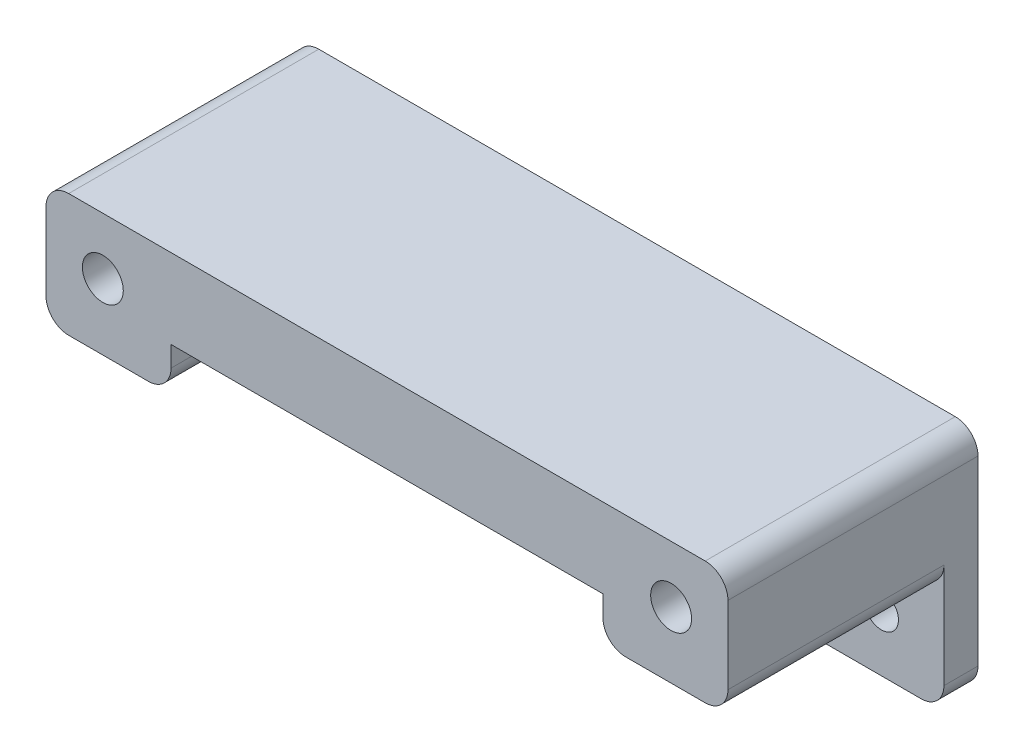
ISO-10303-21;
HEADER;
FILE_DESCRIPTION(('STEP AP214'),'2;1');
FILE_NAME('part.step','',(''),(''),'','','');
FILE_SCHEMA(('AUTOMOTIVE_DESIGN { 1 0 10303 214 1 1 1 1 }'));
ENDSEC;
DATA;
#1=APPLICATION_CONTEXT('core data for automotive mechanical design processes');
#2=APPLICATION_PROTOCOL_DEFINITION('international standard','automotive_design',2000,#1);
#3=PRODUCT_CONTEXT('',#1,'mechanical');
#4=PRODUCT('Part','Part','',(#3));
#5=PRODUCT_RELATED_PRODUCT_CATEGORY('part','',(#4));
#6=PRODUCT_DEFINITION_FORMATION('','',#4);
#7=PRODUCT_DEFINITION_CONTEXT('part definition',#1,'design');
#8=PRODUCT_DEFINITION('design','',#6,#7);
#9=PRODUCT_DEFINITION_SHAPE('','',#8);
#10=(LENGTH_UNIT() NAMED_UNIT(*) SI_UNIT(.MILLI.,.METRE.));
#11=(NAMED_UNIT(*) PLANE_ANGLE_UNIT() SI_UNIT($,.RADIAN.));
#12=(NAMED_UNIT(*) SI_UNIT($,.STERADIAN.) SOLID_ANGLE_UNIT());
#13=UNCERTAINTY_MEASURE_WITH_UNIT(LENGTH_MEASURE(1.E-05),#10,'distance_accuracy_value','');
#14=(GEOMETRIC_REPRESENTATION_CONTEXT(3) GLOBAL_UNCERTAINTY_ASSIGNED_CONTEXT((#13)) GLOBAL_UNIT_ASSIGNED_CONTEXT((#10,
#11,#12)) REPRESENTATION_CONTEXT('',''));
#15=CARTESIAN_POINT('',(0.,0.,0.));
#16=DIRECTION('',(0.,0.,1.));
#17=DIRECTION('',(1.,0.,0.));
#18=AXIS2_PLACEMENT_3D('',#15,#16,#17);
#19=CARTESIAN_POINT('',(0.,0.,3.));
#20=DIRECTION('',(0.,0.,1.));
#21=DIRECTION('',(1.,0.,0.));
#22=AXIS2_PLACEMENT_3D('',#19,#20,#21);
#23=PLANE('',#22);
#24=DIRECTION('',(0.,-1.,0.));
#25=VECTOR('',#24,1.);
#26=CARTESIAN_POINT('',(-23.5096153846154,-9.66346153846153,3.));
#27=LINE('',#26,#25);
#28=CARTESIAN_POINT('',(-23.5096153846154,-18.4704612604795,3.));
#29=VERTEX_POINT('',#28);
#30=CARTESIAN_POINT('',(-23.5096153846154,-27.6634615384615,3.));
#31=VERTEX_POINT('',#30);
#32=EDGE_CURVE('E236',#29,#31,#27,.T.);
#33=ORIENTED_EDGE('',*,*,#32,.T.);
#34=CARTESIAN_POINT('',(-21.5096153846154,-27.6634615384615,3.));
#35=DIRECTION('',(0.,0.,1.));
#36=DIRECTION('',(1.,0.,0.));
#37=AXIS2_PLACEMENT_3D('',#34,#35,#36);
#38=CIRCLE('',#37,2.);
#39=CARTESIAN_POINT('',(-21.5096153846154,-29.6634615384615,3.));
#40=VERTEX_POINT('',#39);
#41=EDGE_CURVE('E300',#31,#40,#38,.T.);
#42=ORIENTED_EDGE('',*,*,#41,.T.);
#43=DIRECTION('',(1.,0.,0.));
#44=VECTOR('',#43,1.);
#45=CARTESIAN_POINT('',(-23.5096153846154,-29.6634615384615,3.));
#46=LINE('',#45,#44);
#47=CARTESIAN_POINT('',(34.4903846153846,-29.6634615384615,3.));
#48=VERTEX_POINT('',#47);
#49=EDGE_CURVE('E239',#40,#48,#46,.T.);
#50=ORIENTED_EDGE('',*,*,#49,.T.);
#51=CARTESIAN_POINT('',(34.4903846153846,-27.6634615384615,3.));
#52=DIRECTION('',(0.,0.,1.));
#53=DIRECTION('',(1.,0.,0.));
#54=AXIS2_PLACEMENT_3D('',#51,#52,#53);
#55=CIRCLE('',#54,2.);
#56=CARTESIAN_POINT('',(36.4903846153846,-27.6634615384615,3.));
#57=VERTEX_POINT('',#56);
#58=EDGE_CURVE('E62',#48,#57,#55,.T.);
#59=ORIENTED_EDGE('',*,*,#58,.T.);
#60=DIRECTION('',(0.,1.,0.));
#61=VECTOR('',#60,1.);
#62=CARTESIAN_POINT('',(36.4903846153846,-9.66346153846153,3.));
#63=LINE('',#62,#61);
#64=CARTESIAN_POINT('',(36.4903846153846,-18.4704612604795,3.));
#65=VERTEX_POINT('',#64);
#66=EDGE_CURVE('E57',#57,#65,#63,.T.);
#67=ORIENTED_EDGE('',*,*,#66,.T.);
#68=CARTESIAN_POINT('',(34.4903846153846,-18.4704612604795,3.));
#69=DIRECTION('',(0.,0.,1.));
#70=DIRECTION('',(1.,0.,0.));
#71=AXIS2_PLACEMENT_3D('',#68,#69,#70);
#72=CIRCLE('',#71,2.);
#73=CARTESIAN_POINT('',(34.4903846153846,-20.4704612604795,3.));
#74=VERTEX_POINT('',#73);
#75=EDGE_CURVE('E11',#65,#74,#72,.F.);
#76=ORIENTED_EDGE('',*,*,#75,.T.);
#77=DIRECTION('',(1.,0.,0.));
#78=VECTOR('',#77,1.);
#79=CARTESIAN_POINT('',(36.4903846153846,-20.4704612604795,3.));
#80=LINE('',#79,#78);
#81=CARTESIAN_POINT('',(27.4903846153846,-20.4704612604795,3.));
#82=VERTEX_POINT('',#81);
#83=EDGE_CURVE('E216',#82,#74,#80,.T.);
#84=ORIENTED_EDGE('',*,*,#83,.F.);
#85=CARTESIAN_POINT('',(27.4903846153846,-18.4704612604795,3.));
#86=DIRECTION('',(0.,0.,1.));
#87=DIRECTION('',(1.,0.,0.));
#88=AXIS2_PLACEMENT_3D('',#85,#86,#87);
#89=CIRCLE('',#88,2.);
#90=CARTESIAN_POINT('',(25.4903846153846,-18.4704612604795,3.));
#91=VERTEX_POINT('',#90);
#92=EDGE_CURVE('E317',#82,#91,#89,.F.);
#93=ORIENTED_EDGE('',*,*,#92,.T.);
#94=DIRECTION('',(0.,-1.,0.));
#95=VECTOR('',#94,1.);
#96=CARTESIAN_POINT('',(25.4903846153846,-20.4704612604795,3.));
#97=LINE('',#96,#95);
#98=CARTESIAN_POINT('',(25.4903846153846,-16.6634615384615,3.));
#99=VERTEX_POINT('',#98);
#100=EDGE_CURVE('E213',#99,#91,#97,.T.);
#101=ORIENTED_EDGE('',*,*,#100,.F.);
#102=DIRECTION('',(1.,0.,0.));
#103=VECTOR('',#102,1.);
#104=CARTESIAN_POINT('',(6.49038461538461,-16.6634615384615,3.));
#105=LINE('',#104,#103);
#106=CARTESIAN_POINT('',(-12.5096153846154,-16.6634615384615,3.));
#107=VERTEX_POINT('',#106);
#108=EDGE_CURVE('E185',#107,#99,#105,.T.);
#109=ORIENTED_EDGE('',*,*,#108,.F.);
#110=DIRECTION('',(0.,1.,0.));
#111=VECTOR('',#110,1.);
#112=CARTESIAN_POINT('',(-12.5096153846154,-16.6634615384615,3.));
#113=LINE('',#112,#111);
#114=CARTESIAN_POINT('',(-12.5096153846154,-18.4704612604795,3.));
#115=VERTEX_POINT('',#114);
#116=EDGE_CURVE('E178',#115,#107,#113,.T.);
#117=ORIENTED_EDGE('',*,*,#116,.F.);
#118=CARTESIAN_POINT('',(-14.5096153846154,-18.4704612604795,3.));
#119=DIRECTION('',(0.,0.,1.));
#120=DIRECTION('',(1.,0.,0.));
#121=AXIS2_PLACEMENT_3D('',#118,#119,#120);
#122=CIRCLE('',#121,2.);
#123=CARTESIAN_POINT('',(-14.5096153846154,-20.4704612604795,3.));
#124=VERTEX_POINT('',#123);
#125=EDGE_CURVE('E315',#115,#124,#122,.F.);
#126=ORIENTED_EDGE('',*,*,#125,.T.);
#127=DIRECTION('',(1.,0.,0.));
#128=VECTOR('',#127,1.);
#129=CARTESIAN_POINT('',(-12.5096153846154,-20.4704612604795,3.));
#130=LINE('',#129,#128);
#131=CARTESIAN_POINT('',(-21.5096153846154,-20.4704612604795,3.));
#132=VERTEX_POINT('',#131);
#133=EDGE_CURVE('E219',#132,#124,#130,.T.);
#134=ORIENTED_EDGE('',*,*,#133,.F.);
#135=CARTESIAN_POINT('',(-21.5096153846154,-18.4704612604795,3.));
#136=DIRECTION('',(0.,0.,1.));
#137=DIRECTION('',(1.,0.,0.));
#138=AXIS2_PLACEMENT_3D('',#135,#136,#137);
#139=CIRCLE('',#138,2.);
#140=EDGE_CURVE('E51',#132,#29,#139,.F.);
#141=ORIENTED_EDGE('',*,*,#140,.T.);
#142=EDGE_LOOP('',(#33,#42,#50,#59,#67,#76,#84,#93,#101,#109,#117,#126,#134,#141));
#143=FACE_BOUND('',#142,.T.);
#144=CARTESIAN_POINT('',(30.9903846153846,-24.6634615384615,3.));
#145=DIRECTION('',(0.,0.,1.));
#146=DIRECTION('',(1.,0.,0.));
#147=AXIS2_PLACEMENT_3D('',#144,#145,#146);
#148=CIRCLE('',#147,1.5);
#149=CARTESIAN_POINT('',(32.4903846153846,-24.6634615384615,3.));
#150=VERTEX_POINT('',#149);
#151=EDGE_CURVE('E230',#150,#150,#148,.T.);
#152=ORIENTED_EDGE('',*,*,#151,.F.);
#153=EDGE_LOOP('',(#152));
#154=FACE_BOUND('',#153,.T.);
#155=CARTESIAN_POINT('',(-18.0096153846154,-24.6634615384615,3.));
#156=DIRECTION('',(0.,0.,1.));
#157=DIRECTION('',(1.,0.,0.));
#158=AXIS2_PLACEMENT_3D('',#155,#156,#157);
#159=CIRCLE('',#158,1.5);
#160=CARTESIAN_POINT('',(-16.5096153846154,-24.6634615384615,3.));
#161=VERTEX_POINT('',#160);
#162=EDGE_CURVE('E224',#161,#161,#159,.T.);
#163=ORIENTED_EDGE('',*,*,#162,.F.);
#164=EDGE_LOOP('',(#163));
#165=FACE_BOUND('',#164,.T.);
#166=ADVANCED_FACE('F43',(#143,#154,#165),#23,.T.);
#167=CARTESIAN_POINT('',(0.,0.,0.));
#168=DIRECTION('',(0.,0.,1.));
#169=DIRECTION('',(1.,0.,0.));
#170=AXIS2_PLACEMENT_3D('',#167,#168,#169);
#171=PLANE('',#170);
#172=CARTESIAN_POINT('',(31.4903846153846,-14.6634615384615,0.));
#173=DIRECTION('',(0.,0.,1.));
#174=DIRECTION('',(1.,0.,0.));
#175=AXIS2_PLACEMENT_3D('',#172,#173,#174);
#176=CIRCLE('',#175,1.8);
#177=CARTESIAN_POINT('',(33.2903846153846,-14.6634615384615,0.));
#178=VERTEX_POINT('',#177);
#179=EDGE_CURVE('E214',#178,#178,#176,.T.);
#180=ORIENTED_EDGE('',*,*,#179,.T.);
#181=EDGE_LOOP('',(#180));
#182=FACE_BOUND('',#181,.T.);
#183=CARTESIAN_POINT('',(-18.5096153846154,-14.6634615384615,0.));
#184=DIRECTION('',(0.,0.,1.));
#185=DIRECTION('',(1.,0.,0.));
#186=AXIS2_PLACEMENT_3D('',#183,#184,#185);
#187=CIRCLE('',#186,1.8);
#188=CARTESIAN_POINT('',(-16.7096153846154,-14.6634615384615,0.));
#189=VERTEX_POINT('',#188);
#190=EDGE_CURVE('E428',#189,#189,#187,.T.);
#191=ORIENTED_EDGE('',*,*,#190,.T.);
#192=EDGE_LOOP('',(#191));
#193=FACE_BOUND('',#192,.T.);
#194=DIRECTION('',(1.,0.,0.));
#195=VECTOR('',#194,1.);
#196=CARTESIAN_POINT('',(-23.5096153846154,-29.6634615384615,0.));
#197=LINE('',#196,#195);
#198=CARTESIAN_POINT('',(-21.5096153846154,-29.6634615384615,0.));
#199=VERTEX_POINT('',#198);
#200=CARTESIAN_POINT('',(34.4903846153846,-29.6634615384615,0.));
#201=VERTEX_POINT('',#200);
#202=EDGE_CURVE('E246',#199,#201,#197,.T.);
#203=ORIENTED_EDGE('',*,*,#202,.F.);
#204=CARTESIAN_POINT('',(-21.5096153846154,-27.6634615384615,0.));
#205=DIRECTION('',(0.,0.,1.));
#206=DIRECTION('',(1.,0.,0.));
#207=AXIS2_PLACEMENT_3D('',#204,#205,#206);
#208=CIRCLE('',#207,2.);
#209=CARTESIAN_POINT('',(-23.5096153846154,-27.6634615384615,0.));
#210=VERTEX_POINT('',#209);
#211=EDGE_CURVE('E290',#199,#210,#208,.F.);
#212=ORIENTED_EDGE('',*,*,#211,.T.);
#213=DIRECTION('',(0.,-1.,0.));
#214=VECTOR('',#213,1.);
#215=CARTESIAN_POINT('',(-23.5096153846154,-9.66346153846153,0.));
#216=LINE('',#215,#214);
#217=CARTESIAN_POINT('',(-23.5096153846154,-11.6634615384615,0.));
#218=VERTEX_POINT('',#217);
#219=EDGE_CURVE('E233',#218,#210,#216,.T.);
#220=ORIENTED_EDGE('',*,*,#219,.F.);
#221=CARTESIAN_POINT('',(-21.5096153846154,-11.6634615384615,0.));
#222=DIRECTION('',(0.,0.,1.));
#223=DIRECTION('',(1.,0.,0.));
#224=AXIS2_PLACEMENT_3D('',#221,#222,#223);
#225=CIRCLE('',#224,2.);
#226=CARTESIAN_POINT('',(-21.5096153846154,-9.66346153846153,0.));
#227=VERTEX_POINT('',#226);
#228=EDGE_CURVE('E286',#218,#227,#225,.F.);
#229=ORIENTED_EDGE('',*,*,#228,.T.);
#230=DIRECTION('',(-1.,0.,0.));
#231=VECTOR('',#230,1.);
#232=CARTESIAN_POINT('',(-23.5096153846154,-9.66346153846153,0.));
#233=LINE('',#232,#231);
#234=CARTESIAN_POINT('',(34.4903846153846,-9.66346153846153,0.));
#235=VERTEX_POINT('',#234);
#236=EDGE_CURVE('E240',#235,#227,#233,.T.);
#237=ORIENTED_EDGE('',*,*,#236,.F.);
#238=CARTESIAN_POINT('',(34.4903846153846,-11.6634615384615,0.));
#239=DIRECTION('',(0.,0.,1.));
#240=DIRECTION('',(1.,0.,0.));
#241=AXIS2_PLACEMENT_3D('',#238,#239,#240);
#242=CIRCLE('',#241,2.);
#243=CARTESIAN_POINT('',(36.4903846153846,-11.6634615384615,0.));
#244=VERTEX_POINT('',#243);
#245=EDGE_CURVE('E284',#235,#244,#242,.F.);
#246=ORIENTED_EDGE('',*,*,#245,.T.);
#247=DIRECTION('',(0.,1.,0.));
#248=VECTOR('',#247,1.);
#249=CARTESIAN_POINT('',(36.4903846153846,-9.66346153846153,0.));
#250=LINE('',#249,#248);
#251=CARTESIAN_POINT('',(36.4903846153846,-27.6634615384615,0.));
#252=VERTEX_POINT('',#251);
#253=EDGE_CURVE('E249',#252,#244,#250,.T.);
#254=ORIENTED_EDGE('',*,*,#253,.F.);
#255=CARTESIAN_POINT('',(34.4903846153846,-27.6634615384615,0.));
#256=DIRECTION('',(0.,0.,1.));
#257=DIRECTION('',(1.,0.,0.));
#258=AXIS2_PLACEMENT_3D('',#255,#256,#257);
#259=CIRCLE('',#258,2.);
#260=EDGE_CURVE('E288',#252,#201,#259,.F.);
#261=ORIENTED_EDGE('',*,*,#260,.T.);
#262=EDGE_LOOP('',(#203,#212,#220,#229,#237,#246,#254,#261));
#263=FACE_BOUND('',#262,.T.);
#264=CARTESIAN_POINT('',(30.9903846153846,-24.6634615384615,0.));
#265=DIRECTION('',(0.,0.,1.));
#266=DIRECTION('',(1.,0.,0.));
#267=AXIS2_PLACEMENT_3D('',#264,#265,#266);
#268=CIRCLE('',#267,1.5);
#269=CARTESIAN_POINT('',(32.4903846153846,-24.6634615384615,0.));
#270=VERTEX_POINT('',#269);
#271=EDGE_CURVE('E227',#270,#270,#268,.T.);
#272=ORIENTED_EDGE('',*,*,#271,.T.);
#273=EDGE_LOOP('',(#272));
#274=FACE_BOUND('',#273,.T.);
#275=CARTESIAN_POINT('',(-18.0096153846154,-24.6634615384615,0.));
#276=DIRECTION('',(0.,0.,1.));
#277=DIRECTION('',(1.,0.,0.));
#278=AXIS2_PLACEMENT_3D('',#275,#276,#277);
#279=CIRCLE('',#278,1.5);
#280=CARTESIAN_POINT('',(-16.5096153846154,-24.6634615384615,0.));
#281=VERTEX_POINT('',#280);
#282=EDGE_CURVE('E188',#281,#281,#279,.T.);
#283=ORIENTED_EDGE('',*,*,#282,.T.);
#284=EDGE_LOOP('',(#283));
#285=FACE_BOUND('',#284,.T.);
#286=ADVANCED_FACE('F341',(#182,#193,#263,#274,#285),#171,.F.);
#287=CARTESIAN_POINT('',(-23.5096153846154,-9.66346153846153,3.));
#288=DIRECTION('',(1.,0.,0.));
#289=DIRECTION('',(0.,1.,0.));
#290=AXIS2_PLACEMENT_3D('',#287,#288,#289);
#291=PLANE('',#290);
#292=ORIENTED_EDGE('',*,*,#219,.T.);
#293=DIRECTION('',(0.,0.,-1.));
#294=VECTOR('',#293,1.);
#295=CARTESIAN_POINT('',(-23.5096153846154,-27.6634615384615,3.));
#296=LINE('',#295,#294);
#297=EDGE_CURVE('E297',#210,#31,#296,.F.);
#298=ORIENTED_EDGE('',*,*,#297,.T.);
#299=ORIENTED_EDGE('',*,*,#32,.F.);
#300=DIRECTION('',(0.,0.,-1.));
#301=VECTOR('',#300,1.);
#302=CARTESIAN_POINT('',(-23.5096153846154,-18.4704612604795,3.));
#303=LINE('',#302,#301);
#304=CARTESIAN_POINT('',(-23.5096153846154,-18.4704612604795,22.));
#305=VERTEX_POINT('',#304);
#306=EDGE_CURVE('E295',#29,#305,#303,.F.);
#307=ORIENTED_EDGE('',*,*,#306,.T.);
#308=DIRECTION('',(0.,-1.,0.));
#309=VECTOR('',#308,1.);
#310=CARTESIAN_POINT('',(-23.5096153846154,-20.4704612604795,22.));
#311=LINE('',#310,#309);
#312=CARTESIAN_POINT('',(-23.5096153846154,-11.6634615384615,22.));
#313=VERTEX_POINT('',#312);
#314=EDGE_CURVE('E206',#313,#305,#311,.T.);
#315=ORIENTED_EDGE('',*,*,#314,.F.);
#316=DIRECTION('',(0.,0.,-1.));
#317=VECTOR('',#316,1.);
#318=CARTESIAN_POINT('',(-23.5096153846154,-11.6634615384615,3.));
#319=LINE('',#318,#317);
#320=EDGE_CURVE('E292',#313,#218,#319,.T.);
#321=ORIENTED_EDGE('',*,*,#320,.T.);
#322=EDGE_LOOP('',(#292,#298,#299,#307,#315,#321));
#323=FACE_BOUND('',#322,.T.);
#324=ADVANCED_FACE('F329',(#323),#291,.F.);
#325=CARTESIAN_POINT('',(-23.5096153846154,-29.6634615384615,3.));
#326=DIRECTION('',(0.,1.,0.));
#327=DIRECTION('',(0.,0.,1.));
#328=AXIS2_PLACEMENT_3D('',#325,#326,#327);
#329=PLANE('',#328);
#330=ORIENTED_EDGE('',*,*,#49,.F.);
#331=DIRECTION('',(0.,0.,-1.));
#332=VECTOR('',#331,1.);
#333=CARTESIAN_POINT('',(-21.5096153846154,-29.6634615384615,3.));
#334=LINE('',#333,#332);
#335=EDGE_CURVE('E281',#40,#199,#334,.T.);
#336=ORIENTED_EDGE('',*,*,#335,.T.);
#337=ORIENTED_EDGE('',*,*,#202,.T.);
#338=DIRECTION('',(0.,0.,-1.));
#339=VECTOR('',#338,1.);
#340=CARTESIAN_POINT('',(34.4903846153846,-29.6634615384615,3.));
#341=LINE('',#340,#339);
#342=EDGE_CURVE('E279',#201,#48,#341,.F.);
#343=ORIENTED_EDGE('',*,*,#342,.T.);
#344=EDGE_LOOP('',(#330,#336,#337,#343));
#345=FACE_BOUND('',#344,.T.);
#346=ADVANCED_FACE('F349',(#345),#329,.F.);
#347=CARTESIAN_POINT('',(36.4903846153846,-9.66346153846153,3.));
#348=DIRECTION('',(-1.,0.,0.));
#349=DIRECTION('',(0.,0.,1.));
#350=AXIS2_PLACEMENT_3D('',#347,#348,#349);
#351=PLANE('',#350);
#352=ORIENTED_EDGE('',*,*,#66,.F.);
#353=DIRECTION('',(0.,0.,-1.));
#354=VECTOR('',#353,1.);
#355=CARTESIAN_POINT('',(36.4903846153846,-27.6634615384615,3.));
#356=LINE('',#355,#354);
#357=EDGE_CURVE('E307',#57,#252,#356,.T.);
#358=ORIENTED_EDGE('',*,*,#357,.T.);
#359=ORIENTED_EDGE('',*,*,#253,.T.);
#360=DIRECTION('',(0.,0.,-1.));
#361=VECTOR('',#360,1.);
#362=CARTESIAN_POINT('',(36.4903846153846,-11.6634615384615,3.));
#363=LINE('',#362,#361);
#364=CARTESIAN_POINT('',(36.4903846153846,-11.6634615384615,22.));
#365=VERTEX_POINT('',#364);
#366=EDGE_CURVE('E302',#244,#365,#363,.F.);
#367=ORIENTED_EDGE('',*,*,#366,.T.);
#368=DIRECTION('',(0.,1.,0.));
#369=VECTOR('',#368,1.);
#370=CARTESIAN_POINT('',(36.4903846153846,-9.66346153846153,22.));
#371=LINE('',#370,#369);
#372=CARTESIAN_POINT('',(36.4903846153846,-18.4704612604795,22.));
#373=VERTEX_POINT('',#372);
#374=EDGE_CURVE('E197',#373,#365,#371,.T.);
#375=ORIENTED_EDGE('',*,*,#374,.F.);
#376=DIRECTION('',(0.,0.,-1.));
#377=VECTOR('',#376,1.);
#378=CARTESIAN_POINT('',(36.4903846153846,-18.4704612604795,3.));
#379=LINE('',#378,#377);
#380=EDGE_CURVE('E304',#373,#65,#379,.T.);
#381=ORIENTED_EDGE('',*,*,#380,.T.);
#382=EDGE_LOOP('',(#352,#358,#359,#367,#375,#381));
#383=FACE_BOUND('',#382,.T.);
#384=ADVANCED_FACE('F356',(#383),#351,.F.);
#385=CARTESIAN_POINT('',(-23.5096153846154,-9.66346153846153,3.));
#386=DIRECTION('',(0.,-1.,0.));
#387=DIRECTION('',(0.,0.,-1.));
#388=AXIS2_PLACEMENT_3D('',#385,#386,#387);
#389=PLANE('',#388);
#390=ORIENTED_EDGE('',*,*,#236,.T.);
#391=DIRECTION('',(0.,0.,-1.));
#392=VECTOR('',#391,1.);
#393=CARTESIAN_POINT('',(-21.5096153846154,-9.66346153846153,3.));
#394=LINE('',#393,#392);
#395=CARTESIAN_POINT('',(-21.5096153846154,-9.66346153846153,22.));
#396=VERTEX_POINT('',#395);
#397=EDGE_CURVE('E313',#227,#396,#394,.F.);
#398=ORIENTED_EDGE('',*,*,#397,.T.);
#399=DIRECTION('',(-1.,0.,0.));
#400=VECTOR('',#399,1.);
#401=CARTESIAN_POINT('',(-23.5096153846154,-9.66346153846153,22.));
#402=LINE('',#401,#400);
#403=CARTESIAN_POINT('',(34.4903846153846,-9.66346153846153,22.));
#404=VERTEX_POINT('',#403);
#405=EDGE_CURVE('E203',#404,#396,#402,.T.);
#406=ORIENTED_EDGE('',*,*,#405,.F.);
#407=DIRECTION('',(0.,0.,-1.));
#408=VECTOR('',#407,1.);
#409=CARTESIAN_POINT('',(34.4903846153846,-9.66346153846153,3.));
#410=LINE('',#409,#408);
#411=EDGE_CURVE('E310',#404,#235,#410,.T.);
#412=ORIENTED_EDGE('',*,*,#411,.T.);
#413=EDGE_LOOP('',(#390,#398,#406,#412));
#414=FACE_BOUND('',#413,.T.);
#415=ADVANCED_FACE('F362',(#414),#389,.F.);
#416=CARTESIAN_POINT('',(30.9903846153846,-24.6634615384615,3.));
#417=DIRECTION('',(0.,0.,-1.));
#418=DIRECTION('',(-1.,0.,0.));
#419=AXIS2_PLACEMENT_3D('',#416,#417,#418);
#420=CYLINDRICAL_SURFACE('',#419,1.5);
#421=ORIENTED_EDGE('',*,*,#151,.T.);
#422=EDGE_LOOP('',(#421));
#423=FACE_BOUND('',#422,.T.);
#424=ORIENTED_EDGE('',*,*,#271,.F.);
#425=EDGE_LOOP('',(#424));
#426=FACE_BOUND('',#425,.T.);
#427=ADVANCED_FACE('F364',(#423,#426),#420,.F.);
#428=CARTESIAN_POINT('',(-18.0096153846154,-24.6634615384615,3.));
#429=DIRECTION('',(0.,0.,-1.));
#430=DIRECTION('',(-1.,0.,0.));
#431=AXIS2_PLACEMENT_3D('',#428,#429,#430);
#432=CYLINDRICAL_SURFACE('',#431,1.5);
#433=ORIENTED_EDGE('',*,*,#162,.T.);
#434=EDGE_LOOP('',(#433));
#435=FACE_BOUND('',#434,.T.);
#436=ORIENTED_EDGE('',*,*,#282,.F.);
#437=EDGE_LOOP('',(#436));
#438=FACE_BOUND('',#437,.T.);
#439=ADVANCED_FACE('F371',(#435,#438),#432,.F.);
#440=CARTESIAN_POINT('',(6.49038461538461,-16.6634615384615,22.));
#441=DIRECTION('',(0.,1.,0.));
#442=DIRECTION('',(-1.,0.,0.));
#443=AXIS2_PLACEMENT_3D('',#440,#441,#442);
#444=PLANE('',#443);
#445=ORIENTED_EDGE('',*,*,#108,.T.);
#446=DIRECTION('',(0.,0.,-1.));
#447=VECTOR('',#446,1.);
#448=CARTESIAN_POINT('',(25.4903846153846,-16.6634615384615,22.));
#449=LINE('',#448,#447);
#450=CARTESIAN_POINT('',(25.4903846153846,-16.6634615384615,22.));
#451=VERTEX_POINT('',#450);
#452=EDGE_CURVE('E182',#451,#99,#449,.T.);
#453=ORIENTED_EDGE('',*,*,#452,.F.);
#454=DIRECTION('',(1.,0.,0.));
#455=VECTOR('',#454,1.);
#456=CARTESIAN_POINT('',(6.49038461538461,-16.6634615384615,22.));
#457=LINE('',#456,#455);
#458=CARTESIAN_POINT('',(-12.5096153846154,-16.6634615384615,22.));
#459=VERTEX_POINT('',#458);
#460=EDGE_CURVE('E166',#459,#451,#457,.T.);
#461=ORIENTED_EDGE('',*,*,#460,.F.);
#462=DIRECTION('',(0.,0.,-1.));
#463=VECTOR('',#462,1.);
#464=CARTESIAN_POINT('',(-12.5096153846154,-16.6634615384615,22.));
#465=LINE('',#464,#463);
#466=EDGE_CURVE('E189',#459,#107,#465,.T.);
#467=ORIENTED_EDGE('',*,*,#466,.T.);
#468=EDGE_LOOP('',(#445,#453,#461,#467));
#469=FACE_BOUND('',#468,.T.);
#470=ADVANCED_FACE('F183',(#469),#444,.F.);
#471=CARTESIAN_POINT('',(25.4903846153846,-20.4704612604795,22.));
#472=DIRECTION('',(1.,0.,0.));
#473=DIRECTION('',(0.,0.,-1.));
#474=AXIS2_PLACEMENT_3D('',#471,#472,#473);
#475=PLANE('',#474);
#476=ORIENTED_EDGE('',*,*,#100,.T.);
#477=DIRECTION('',(0.,0.,-1.));
#478=VECTOR('',#477,1.);
#479=CARTESIAN_POINT('',(25.4903846153846,-18.4704612604795,22.));
#480=LINE('',#479,#478);
#481=CARTESIAN_POINT('',(25.4903846153846,-18.4704612604795,22.));
#482=VERTEX_POINT('',#481);
#483=EDGE_CURVE('E193',#91,#482,#480,.F.);
#484=ORIENTED_EDGE('',*,*,#483,.T.);
#485=DIRECTION('',(0.,-1.,0.));
#486=VECTOR('',#485,1.);
#487=CARTESIAN_POINT('',(25.4903846153846,-20.4704612604795,22.));
#488=LINE('',#487,#486);
#489=EDGE_CURVE('E171',#451,#482,#488,.T.);
#490=ORIENTED_EDGE('',*,*,#489,.F.);
#491=ORIENTED_EDGE('',*,*,#452,.T.);
#492=EDGE_LOOP('',(#476,#484,#490,#491));
#493=FACE_BOUND('',#492,.T.);
#494=ADVANCED_FACE('F191',(#493),#475,.F.);
#495=CARTESIAN_POINT('',(36.4903846153846,-20.4704612604795,22.));
#496=DIRECTION('',(0.,1.,0.));
#497=DIRECTION('',(0.,0.,1.));
#498=AXIS2_PLACEMENT_3D('',#495,#496,#497);
#499=PLANE('',#498);
#500=DIRECTION('',(1.,0.,0.));
#501=VECTOR('',#500,1.);
#502=CARTESIAN_POINT('',(36.4903846153846,-20.4704612604795,22.));
#503=LINE('',#502,#501);
#504=CARTESIAN_POINT('',(27.4903846153846,-20.4704612604795,22.));
#505=VERTEX_POINT('',#504);
#506=CARTESIAN_POINT('',(34.4903846153846,-20.4704612604795,22.));
#507=VERTEX_POINT('',#506);
#508=EDGE_CURVE('E194',#505,#507,#503,.T.);
#509=ORIENTED_EDGE('',*,*,#508,.F.);
#510=DIRECTION('',(0.,0.,-1.));
#511=VECTOR('',#510,1.);
#512=CARTESIAN_POINT('',(27.4903846153846,-20.4704612604795,22.));
#513=LINE('',#512,#511);
#514=EDGE_CURVE('E275',#505,#82,#513,.T.);
#515=ORIENTED_EDGE('',*,*,#514,.T.);
#516=ORIENTED_EDGE('',*,*,#83,.T.);
#517=DIRECTION('',(0.,0.,-1.));
#518=VECTOR('',#517,1.);
#519=CARTESIAN_POINT('',(34.4903846153846,-20.4704612604795,22.));
#520=LINE('',#519,#518);
#521=EDGE_CURVE('E273',#74,#507,#520,.F.);
#522=ORIENTED_EDGE('',*,*,#521,.T.);
#523=EDGE_LOOP('',(#509,#515,#516,#522));
#524=FACE_BOUND('',#523,.T.);
#525=ADVANCED_FACE('F390',(#524),#499,.F.);
#526=CARTESIAN_POINT('',(-12.5096153846154,-20.4704612604795,22.));
#527=DIRECTION('',(0.,1.,0.));
#528=DIRECTION('',(0.,0.,1.));
#529=AXIS2_PLACEMENT_3D('',#526,#527,#528);
#530=PLANE('',#529);
#531=ORIENTED_EDGE('',*,*,#133,.T.);
#532=DIRECTION('',(0.,0.,-1.));
#533=VECTOR('',#532,1.);
#534=CARTESIAN_POINT('',(-14.5096153846154,-20.4704612604795,22.));
#535=LINE('',#534,#533);
#536=CARTESIAN_POINT('',(-14.5096153846154,-20.4704612604795,22.));
#537=VERTEX_POINT('',#536);
#538=EDGE_CURVE('E259',#124,#537,#535,.F.);
#539=ORIENTED_EDGE('',*,*,#538,.T.);
#540=DIRECTION('',(1.,0.,0.));
#541=VECTOR('',#540,1.);
#542=CARTESIAN_POINT('',(-12.5096153846154,-20.4704612604795,22.));
#543=LINE('',#542,#541);
#544=CARTESIAN_POINT('',(-21.5096153846154,-20.4704612604795,22.));
#545=VERTEX_POINT('',#544);
#546=EDGE_CURVE('E209',#545,#537,#543,.T.);
#547=ORIENTED_EDGE('',*,*,#546,.F.);
#548=DIRECTION('',(0.,0.,-1.));
#549=VECTOR('',#548,1.);
#550=CARTESIAN_POINT('',(-21.5096153846154,-20.4704612604795,22.));
#551=LINE('',#550,#549);
#552=EDGE_CURVE('E256',#545,#132,#551,.T.);
#553=ORIENTED_EDGE('',*,*,#552,.T.);
#554=EDGE_LOOP('',(#531,#539,#547,#553));
#555=FACE_BOUND('',#554,.T.);
#556=ADVANCED_FACE('F393',(#555),#530,.F.);
#557=CARTESIAN_POINT('',(-12.5096153846154,-16.6634615384615,22.));
#558=DIRECTION('',(-1.,0.,0.));
#559=DIRECTION('',(0.,0.,1.));
#560=AXIS2_PLACEMENT_3D('',#557,#558,#559);
#561=PLANE('',#560);
#562=DIRECTION('',(0.,1.,0.));
#563=VECTOR('',#562,1.);
#564=CARTESIAN_POINT('',(-12.5096153846154,-16.6634615384615,22.));
#565=LINE('',#564,#563);
#566=CARTESIAN_POINT('',(-12.5096153846154,-18.4704612604795,22.));
#567=VERTEX_POINT('',#566);
#568=EDGE_CURVE('E174',#567,#459,#565,.T.);
#569=ORIENTED_EDGE('',*,*,#568,.F.);
#570=DIRECTION('',(0.,0.,-1.));
#571=VECTOR('',#570,1.);
#572=CARTESIAN_POINT('',(-12.5096153846154,-18.4704612604795,22.));
#573=LINE('',#572,#571);
#574=EDGE_CURVE('E243',#567,#115,#573,.T.);
#575=ORIENTED_EDGE('',*,*,#574,.T.);
#576=ORIENTED_EDGE('',*,*,#116,.T.);
#577=ORIENTED_EDGE('',*,*,#466,.F.);
#578=EDGE_LOOP('',(#569,#575,#576,#577));
#579=FACE_BOUND('',#578,.T.);
#580=ADVANCED_FACE('F397',(#579),#561,.F.);
#581=CARTESIAN_POINT('',(0.,0.,22.));
#582=DIRECTION('',(0.,0.,1.));
#583=DIRECTION('',(1.,0.,0.));
#584=AXIS2_PLACEMENT_3D('',#581,#582,#583);
#585=PLANE('',#584);
#586=CARTESIAN_POINT('',(31.4903846153846,-14.6634615384615,22.));
#587=DIRECTION('',(0.,0.,1.));
#588=DIRECTION('',(1.,0.,0.));
#589=AXIS2_PLACEMENT_3D('',#586,#587,#588);
#590=CIRCLE('',#589,1.8);
#591=CARTESIAN_POINT('',(33.2903846153846,-14.6634615384615,22.));
#592=VERTEX_POINT('',#591);
#593=EDGE_CURVE('E423',#592,#592,#590,.T.);
#594=ORIENTED_EDGE('',*,*,#593,.F.);
#595=EDGE_LOOP('',(#594));
#596=FACE_BOUND('',#595,.T.);
#597=CARTESIAN_POINT('',(-18.5096153846154,-14.6634615384615,22.));
#598=DIRECTION('',(0.,0.,1.));
#599=DIRECTION('',(1.,0.,0.));
#600=AXIS2_PLACEMENT_3D('',#597,#598,#599);
#601=CIRCLE('',#600,1.8);
#602=CARTESIAN_POINT('',(-16.7096153846154,-14.6634615384615,22.));
#603=VERTEX_POINT('',#602);
#604=EDGE_CURVE('E424',#603,#603,#601,.T.);
#605=ORIENTED_EDGE('',*,*,#604,.F.);
#606=EDGE_LOOP('',(#605));
#607=FACE_BOUND('',#606,.T.);
#608=ORIENTED_EDGE('',*,*,#546,.T.);
#609=CARTESIAN_POINT('',(-14.5096153846154,-18.4704612604795,22.));
#610=DIRECTION('',(0.,0.,1.));
#611=DIRECTION('',(1.,0.,0.));
#612=AXIS2_PLACEMENT_3D('',#609,#610,#611);
#613=CIRCLE('',#612,2.);
#614=EDGE_CURVE('E271',#537,#567,#613,.T.);
#615=ORIENTED_EDGE('',*,*,#614,.T.);
#616=ORIENTED_EDGE('',*,*,#568,.T.);
#617=ORIENTED_EDGE('',*,*,#460,.T.);
#618=ORIENTED_EDGE('',*,*,#489,.T.);
#619=CARTESIAN_POINT('',(27.4903846153846,-18.4704612604795,22.));
#620=DIRECTION('',(0.,0.,1.));
#621=DIRECTION('',(1.,0.,0.));
#622=AXIS2_PLACEMENT_3D('',#619,#620,#621);
#623=CIRCLE('',#622,2.);
#624=EDGE_CURVE('E269',#482,#505,#623,.T.);
#625=ORIENTED_EDGE('',*,*,#624,.T.);
#626=ORIENTED_EDGE('',*,*,#508,.T.);
#627=CARTESIAN_POINT('',(34.4903846153846,-18.4704612604795,22.));
#628=DIRECTION('',(0.,0.,1.));
#629=DIRECTION('',(1.,0.,0.));
#630=AXIS2_PLACEMENT_3D('',#627,#628,#629);
#631=CIRCLE('',#630,2.);
#632=EDGE_CURVE('E265',#507,#373,#631,.T.);
#633=ORIENTED_EDGE('',*,*,#632,.T.);
#634=ORIENTED_EDGE('',*,*,#374,.T.);
#635=CARTESIAN_POINT('',(34.4903846153846,-11.6634615384615,22.));
#636=DIRECTION('',(0.,0.,1.));
#637=DIRECTION('',(1.,0.,0.));
#638=AXIS2_PLACEMENT_3D('',#635,#636,#637);
#639=CIRCLE('',#638,2.);
#640=EDGE_CURVE('E261',#365,#404,#639,.T.);
#641=ORIENTED_EDGE('',*,*,#640,.T.);
#642=ORIENTED_EDGE('',*,*,#405,.T.);
#643=CARTESIAN_POINT('',(-21.5096153846154,-11.6634615384615,22.));
#644=DIRECTION('',(0.,0.,1.));
#645=DIRECTION('',(1.,0.,0.));
#646=AXIS2_PLACEMENT_3D('',#643,#644,#645);
#647=CIRCLE('',#646,2.);
#648=EDGE_CURVE('E263',#396,#313,#647,.T.);
#649=ORIENTED_EDGE('',*,*,#648,.T.);
#650=ORIENTED_EDGE('',*,*,#314,.T.);
#651=CARTESIAN_POINT('',(-21.5096153846154,-18.4704612604795,22.));
#652=DIRECTION('',(0.,0.,1.));
#653=DIRECTION('',(1.,0.,0.));
#654=AXIS2_PLACEMENT_3D('',#651,#652,#653);
#655=CIRCLE('',#654,2.);
#656=EDGE_CURVE('E267',#305,#545,#655,.T.);
#657=ORIENTED_EDGE('',*,*,#656,.T.);
#658=EDGE_LOOP('',(#608,#615,#616,#617,#618,#625,#626,#633,#634,#641,#642,#649,#650,#657));
#659=FACE_BOUND('',#658,.T.);
#660=ADVANCED_FACE('F169',(#596,#607,#659),#585,.T.);
#661=CARTESIAN_POINT('',(-18.5096153846154,-14.6634615384615,0.));
#662=DIRECTION('',(0.,0.,1.));
#663=DIRECTION('',(1.,0.,0.));
#664=AXIS2_PLACEMENT_3D('',#661,#662,#663);
#665=CYLINDRICAL_SURFACE('',#664,1.8);
#666=ORIENTED_EDGE('',*,*,#190,.F.);
#667=EDGE_LOOP('',(#666));
#668=FACE_BOUND('',#667,.T.);
#669=ORIENTED_EDGE('',*,*,#604,.T.);
#670=EDGE_LOOP('',(#669));
#671=FACE_BOUND('',#670,.T.);
#672=ADVANCED_FACE('F404',(#668,#671),#665,.F.);
#673=CARTESIAN_POINT('',(31.4903846153846,-14.6634615384615,0.));
#674=DIRECTION('',(0.,0.,1.));
#675=DIRECTION('',(1.,0.,0.));
#676=AXIS2_PLACEMENT_3D('',#673,#674,#675);
#677=CYLINDRICAL_SURFACE('',#676,1.8);
#678=ORIENTED_EDGE('',*,*,#179,.F.);
#679=EDGE_LOOP('',(#678));
#680=FACE_BOUND('',#679,.T.);
#681=ORIENTED_EDGE('',*,*,#593,.T.);
#682=EDGE_LOOP('',(#681));
#683=FACE_BOUND('',#682,.T.);
#684=ADVANCED_FACE('F408',(#680,#683),#677,.F.);
#685=CARTESIAN_POINT('',(-14.5096153846154,-18.4704612604795,22.));
#686=DIRECTION('',(0.,0.,-1.));
#687=DIRECTION('',(-1.,0.,0.));
#688=AXIS2_PLACEMENT_3D('',#685,#686,#687);
#689=CYLINDRICAL_SURFACE('',#688,2.);
#690=ORIENTED_EDGE('',*,*,#614,.F.);
#691=ORIENTED_EDGE('',*,*,#538,.F.);
#692=ORIENTED_EDGE('',*,*,#125,.F.);
#693=ORIENTED_EDGE('',*,*,#574,.F.);
#694=EDGE_LOOP('',(#690,#691,#692,#693));
#695=FACE_BOUND('',#694,.T.);
#696=ADVANCED_FACE('F410',(#695),#689,.T.);
#697=CARTESIAN_POINT('',(27.4903846153846,-18.4704612604795,22.));
#698=DIRECTION('',(0.,0.,-1.));
#699=DIRECTION('',(-1.,0.,0.));
#700=AXIS2_PLACEMENT_3D('',#697,#698,#699);
#701=CYLINDRICAL_SURFACE('',#700,2.);
#702=ORIENTED_EDGE('',*,*,#624,.F.);
#703=ORIENTED_EDGE('',*,*,#483,.F.);
#704=ORIENTED_EDGE('',*,*,#92,.F.);
#705=ORIENTED_EDGE('',*,*,#514,.F.);
#706=EDGE_LOOP('',(#702,#703,#704,#705));
#707=FACE_BOUND('',#706,.T.);
#708=ADVANCED_FACE('F415',(#707),#701,.T.);
#709=CARTESIAN_POINT('',(-21.5096153846154,-27.6634615384615,3.));
#710=DIRECTION('',(0.,0.,-1.));
#711=DIRECTION('',(-1.,0.,0.));
#712=AXIS2_PLACEMENT_3D('',#709,#710,#711);
#713=CYLINDRICAL_SURFACE('',#712,2.);
#714=ORIENTED_EDGE('',*,*,#41,.F.);
#715=ORIENTED_EDGE('',*,*,#297,.F.);
#716=ORIENTED_EDGE('',*,*,#211,.F.);
#717=ORIENTED_EDGE('',*,*,#335,.F.);
#718=EDGE_LOOP('',(#714,#715,#716,#717));
#719=FACE_BOUND('',#718,.T.);
#720=ADVANCED_FACE('F346',(#719),#713,.T.);
#721=CARTESIAN_POINT('',(34.4903846153846,-27.6634615384615,3.));
#722=DIRECTION('',(0.,0.,-1.));
#723=DIRECTION('',(-1.,0.,0.));
#724=AXIS2_PLACEMENT_3D('',#721,#722,#723);
#725=CYLINDRICAL_SURFACE('',#724,2.);
#726=ORIENTED_EDGE('',*,*,#58,.F.);
#727=ORIENTED_EDGE('',*,*,#342,.F.);
#728=ORIENTED_EDGE('',*,*,#260,.F.);
#729=ORIENTED_EDGE('',*,*,#357,.F.);
#730=EDGE_LOOP('',(#726,#727,#728,#729));
#731=FACE_BOUND('',#730,.T.);
#732=ADVANCED_FACE('F353',(#731),#725,.T.);
#733=CARTESIAN_POINT('',(-21.5096153846154,-18.4704612604795,22.));
#734=DIRECTION('',(0.,0.,-1.));
#735=DIRECTION('',(-1.,0.,0.));
#736=AXIS2_PLACEMENT_3D('',#733,#734,#735);
#737=CYLINDRICAL_SURFACE('',#736,2.);
#738=ORIENTED_EDGE('',*,*,#656,.F.);
#739=ORIENTED_EDGE('',*,*,#306,.F.);
#740=ORIENTED_EDGE('',*,*,#140,.F.);
#741=ORIENTED_EDGE('',*,*,#552,.F.);
#742=EDGE_LOOP('',(#738,#739,#740,#741));
#743=FACE_BOUND('',#742,.T.);
#744=ADVANCED_FACE('F326',(#743),#737,.T.);
#745=CARTESIAN_POINT('',(34.4903846153846,-18.4704612604795,3.));
#746=DIRECTION('',(0.,0.,-1.));
#747=DIRECTION('',(-1.,0.,0.));
#748=AXIS2_PLACEMENT_3D('',#745,#746,#747);
#749=CYLINDRICAL_SURFACE('',#748,2.);
#750=ORIENTED_EDGE('',*,*,#632,.F.);
#751=ORIENTED_EDGE('',*,*,#521,.F.);
#752=ORIENTED_EDGE('',*,*,#75,.F.);
#753=ORIENTED_EDGE('',*,*,#380,.F.);
#754=EDGE_LOOP('',(#750,#751,#752,#753));
#755=FACE_BOUND('',#754,.T.);
#756=ADVANCED_FACE('F451',(#755),#749,.T.);
#757=CARTESIAN_POINT('',(-21.5096153846154,-11.6634615384615,3.));
#758=DIRECTION('',(0.,0.,-1.));
#759=DIRECTION('',(-1.,0.,0.));
#760=AXIS2_PLACEMENT_3D('',#757,#758,#759);
#761=CYLINDRICAL_SURFACE('',#760,2.);
#762=ORIENTED_EDGE('',*,*,#648,.F.);
#763=ORIENTED_EDGE('',*,*,#397,.F.);
#764=ORIENTED_EDGE('',*,*,#228,.F.);
#765=ORIENTED_EDGE('',*,*,#320,.F.);
#766=EDGE_LOOP('',(#762,#763,#764,#765));
#767=FACE_BOUND('',#766,.T.);
#768=ADVANCED_FACE('F336',(#767),#761,.T.);
#769=CARTESIAN_POINT('',(34.4903846153846,-11.6634615384615,3.));
#770=DIRECTION('',(0.,0.,-1.));
#771=DIRECTION('',(-1.,0.,0.));
#772=AXIS2_PLACEMENT_3D('',#769,#770,#771);
#773=CYLINDRICAL_SURFACE('',#772,2.);
#774=ORIENTED_EDGE('',*,*,#640,.F.);
#775=ORIENTED_EDGE('',*,*,#366,.F.);
#776=ORIENTED_EDGE('',*,*,#245,.F.);
#777=ORIENTED_EDGE('',*,*,#411,.F.);
#778=EDGE_LOOP('',(#774,#775,#776,#777));
#779=FACE_BOUND('',#778,.T.);
#780=ADVANCED_FACE('F45',(#779),#773,.T.);
#781=CLOSED_SHELL('',(#166,#286,#324,#346,#384,#415,#427,#439,#470,#494,#525,#556,#580,#660,
#672,#684,#696,#708,#720,#732,#744,#756,#768,#780));
#782=MANIFOLD_SOLID_BREP('B2',#781);
#783=ADVANCED_BREP_SHAPE_REPRESENTATION('',(#18,#782),#14);
#784=SHAPE_DEFINITION_REPRESENTATION(#9,#783);
ENDSEC;
END-ISO-10303-21;
